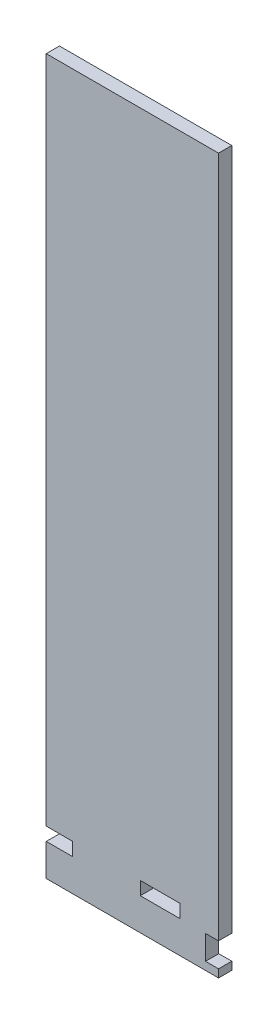
ISO-10303-21;
HEADER;
FILE_DESCRIPTION(('STEP AP214'),'2;1');
FILE_NAME('part.step','',(''),(''),'','','');
FILE_SCHEMA(('AUTOMOTIVE_DESIGN { 1 0 10303 214 1 1 1 1 }'));
ENDSEC;
DATA;
#1=APPLICATION_CONTEXT('core data for automotive mechanical design processes');
#2=APPLICATION_PROTOCOL_DEFINITION('international standard','automotive_design',2000,#1);
#3=PRODUCT_CONTEXT('',#1,'mechanical');
#4=PRODUCT('Part','Part','',(#3));
#5=PRODUCT_RELATED_PRODUCT_CATEGORY('part','',(#4));
#6=PRODUCT_DEFINITION_FORMATION('','',#4);
#7=PRODUCT_DEFINITION_CONTEXT('part definition',#1,'design');
#8=PRODUCT_DEFINITION('design','',#6,#7);
#9=PRODUCT_DEFINITION_SHAPE('','',#8);
#10=(LENGTH_UNIT() NAMED_UNIT(*) SI_UNIT(.MILLI.,.METRE.));
#11=(NAMED_UNIT(*) PLANE_ANGLE_UNIT() SI_UNIT($,.RADIAN.));
#12=(NAMED_UNIT(*) SI_UNIT($,.STERADIAN.) SOLID_ANGLE_UNIT());
#13=UNCERTAINTY_MEASURE_WITH_UNIT(LENGTH_MEASURE(1.E-05),#10,'distance_accuracy_value','');
#14=(GEOMETRIC_REPRESENTATION_CONTEXT(3) GLOBAL_UNCERTAINTY_ASSIGNED_CONTEXT((#13)) GLOBAL_UNIT_ASSIGNED_CONTEXT((#10,
#11,#12)) REPRESENTATION_CONTEXT('',''));
#15=CARTESIAN_POINT('',(0.,0.,0.));
#16=DIRECTION('',(0.,0.,1.));
#17=DIRECTION('',(1.,0.,0.));
#18=AXIS2_PLACEMENT_3D('',#15,#16,#17);
#19=CARTESIAN_POINT('',(65.1210948690311,0.,-5.));
#20=DIRECTION('',(1.,0.,0.));
#21=DIRECTION('',(0.,0.,-1.));
#22=AXIS2_PLACEMENT_3D('',#19,#20,#21);
#23=PLANE('',#22);
#24=DIRECTION('',(0.,0.,1.));
#25=VECTOR('',#24,1.);
#26=CARTESIAN_POINT('',(65.1210948690311,2.9999999999999,-5.));
#27=LINE('',#26,#25);
#28=CARTESIAN_POINT('',(65.1210948690311,2.9999999999999,-5.));
#29=VERTEX_POINT('',#28);
#30=CARTESIAN_POINT('',(65.1210948690311,2.9999999999999,0.));
#31=VERTEX_POINT('',#30);
#32=EDGE_CURVE('E266',#29,#31,#27,.T.);
#33=ORIENTED_EDGE('',*,*,#32,.T.);
#34=DIRECTION('',(0.,1.,0.));
#35=VECTOR('',#34,1.);
#36=CARTESIAN_POINT('',(65.1210948690311,0.,0.));
#37=LINE('',#36,#35);
#38=CARTESIAN_POINT('',(65.1210948690311,0.,0.));
#39=VERTEX_POINT('',#38);
#40=EDGE_CURVE('E188',#39,#31,#37,.T.);
#41=ORIENTED_EDGE('',*,*,#40,.F.);
#42=DIRECTION('',(0.,0.,1.));
#43=VECTOR('',#42,1.);
#44=CARTESIAN_POINT('',(65.1210948690311,0.,-5.));
#45=LINE('',#44,#43);
#46=CARTESIAN_POINT('',(65.1210948690311,0.,-5.));
#47=VERTEX_POINT('',#46);
#48=EDGE_CURVE('E11',#47,#39,#45,.T.);
#49=ORIENTED_EDGE('',*,*,#48,.F.);
#50=DIRECTION('',(0.,1.,0.));
#51=VECTOR('',#50,1.);
#52=CARTESIAN_POINT('',(65.1210948690311,0.,-5.));
#53=LINE('',#52,#51);
#54=EDGE_CURVE('E169',#47,#29,#53,.T.);
#55=ORIENTED_EDGE('',*,*,#54,.T.);
#56=EDGE_LOOP('',(#33,#41,#49,#55));
#57=FACE_BOUND('',#56,.T.);
#58=ADVANCED_FACE('F33',(#57),#23,.T.);
#59=CARTESIAN_POINT('',(0.,0.,-5.));
#60=DIRECTION('',(-1.,0.,0.));
#61=DIRECTION('',(0.,0.,1.));
#62=AXIS2_PLACEMENT_3D('',#59,#60,#61);
#63=PLANE('',#62);
#64=DIRECTION('',(0.,0.,1.));
#65=VECTOR('',#64,1.);
#66=CARTESIAN_POINT('',(0.,17.15,-5.));
#67=LINE('',#66,#65);
#68=CARTESIAN_POINT('',(0.,17.15,-5.));
#69=VERTEX_POINT('',#68);
#70=CARTESIAN_POINT('',(0.,17.15,0.));
#71=VERTEX_POINT('',#70);
#72=EDGE_CURVE('E210',#69,#71,#67,.T.);
#73=ORIENTED_EDGE('',*,*,#72,.T.);
#74=DIRECTION('',(0.,-1.,0.));
#75=VECTOR('',#74,1.);
#76=CARTESIAN_POINT('',(0.,0.,0.));
#77=LINE('',#76,#75);
#78=CARTESIAN_POINT('',(0.,270.,0.));
#79=VERTEX_POINT('',#78);
#80=EDGE_CURVE('E174',#79,#71,#77,.T.);
#81=ORIENTED_EDGE('',*,*,#80,.F.);
#82=DIRECTION('',(0.,0.,1.));
#83=VECTOR('',#82,1.);
#84=CARTESIAN_POINT('',(0.,270.,-5.));
#85=LINE('',#84,#83);
#86=CARTESIAN_POINT('',(0.,270.,-5.));
#87=VERTEX_POINT('',#86);
#88=EDGE_CURVE('E198',#87,#79,#85,.T.);
#89=ORIENTED_EDGE('',*,*,#88,.F.);
#90=DIRECTION('',(0.,-1.,0.));
#91=VECTOR('',#90,1.);
#92=CARTESIAN_POINT('',(0.,0.,-5.));
#93=LINE('',#92,#91);
#94=EDGE_CURVE('E182',#87,#69,#93,.T.);
#95=ORIENTED_EDGE('',*,*,#94,.T.);
#96=EDGE_LOOP('',(#73,#81,#89,#95));
#97=FACE_BOUND('',#96,.T.);
#98=ADVANCED_FACE('F305',(#97),#63,.T.);
#99=DIRECTION('',(0.,0.,1.));
#100=VECTOR('',#99,1.);
#101=CARTESIAN_POINT('',(65.1210948690311,12.15,-5.));
#102=LINE('',#101,#100);
#103=CARTESIAN_POINT('',(65.1210948690311,12.15,-5.));
#104=VERTEX_POINT('',#103);
#105=CARTESIAN_POINT('',(65.1210948690311,12.15,0.));
#106=VERTEX_POINT('',#105);
#107=EDGE_CURVE('E50',#104,#106,#102,.T.);
#108=ORIENTED_EDGE('',*,*,#107,.F.);
#109=CARTESIAN_POINT('',(65.1210948690311,270.,-5.));
#110=VERTEX_POINT('',#109);
#111=EDGE_CURVE('E159',#104,#110,#53,.T.);
#112=ORIENTED_EDGE('',*,*,#111,.T.);
#113=DIRECTION('',(0.,0.,1.));
#114=VECTOR('',#113,1.);
#115=CARTESIAN_POINT('',(65.1210948690311,270.,-5.));
#116=LINE('',#115,#114);
#117=CARTESIAN_POINT('',(65.1210948690311,270.,0.));
#118=VERTEX_POINT('',#117);
#119=EDGE_CURVE('E37',#110,#118,#116,.T.);
#120=ORIENTED_EDGE('',*,*,#119,.T.);
#121=EDGE_CURVE('E161',#106,#118,#37,.T.);
#122=ORIENTED_EDGE('',*,*,#121,.F.);
#123=EDGE_LOOP('',(#108,#112,#120,#122));
#124=FACE_BOUND('',#123,.T.);
#125=ADVANCED_FACE('F35',(#124),#23,.T.);
#126=CARTESIAN_POINT('',(65.1210948690311,0.,-5.));
#127=DIRECTION('',(0.,-1.,0.));
#128=DIRECTION('',(0.,0.,-1.));
#129=AXIS2_PLACEMENT_3D('',#126,#127,#128);
#130=PLANE('',#129);
#131=DIRECTION('',(1.,0.,0.));
#132=VECTOR('',#131,1.);
#133=CARTESIAN_POINT('',(65.1210948690311,0.,0.));
#134=LINE('',#133,#132);
#135=CARTESIAN_POINT('',(0.,0.,0.));
#136=VERTEX_POINT('',#135);
#137=EDGE_CURVE('E170',#136,#39,#134,.T.);
#138=ORIENTED_EDGE('',*,*,#137,.F.);
#139=DIRECTION('',(0.,0.,1.));
#140=VECTOR('',#139,1.);
#141=CARTESIAN_POINT('',(0.,0.,-5.));
#142=LINE('',#141,#140);
#143=CARTESIAN_POINT('',(0.,0.,-5.));
#144=VERTEX_POINT('',#143);
#145=EDGE_CURVE('E42',#144,#136,#142,.T.);
#146=ORIENTED_EDGE('',*,*,#145,.F.);
#147=DIRECTION('',(1.,0.,0.));
#148=VECTOR('',#147,1.);
#149=CARTESIAN_POINT('',(65.1210948690311,0.,-5.));
#150=LINE('',#149,#148);
#151=EDGE_CURVE('E185',#144,#47,#150,.T.);
#152=ORIENTED_EDGE('',*,*,#151,.T.);
#153=ORIENTED_EDGE('',*,*,#48,.T.);
#154=EDGE_LOOP('',(#138,#146,#152,#153));
#155=FACE_BOUND('',#154,.T.);
#156=ADVANCED_FACE('F299',(#155),#130,.T.);
#157=DIRECTION('',(0.,0.,1.));
#158=VECTOR('',#157,1.);
#159=CARTESIAN_POINT('',(0.,12.15,-5.));
#160=LINE('',#159,#158);
#161=CARTESIAN_POINT('',(0.,12.15,-5.));
#162=VERTEX_POINT('',#161);
#163=CARTESIAN_POINT('',(0.,12.15,0.));
#164=VERTEX_POINT('',#163);
#165=EDGE_CURVE('E178',#162,#164,#160,.T.);
#166=ORIENTED_EDGE('',*,*,#165,.F.);
#167=EDGE_CURVE('E181',#162,#144,#93,.T.);
#168=ORIENTED_EDGE('',*,*,#167,.T.);
#169=ORIENTED_EDGE('',*,*,#145,.T.);
#170=EDGE_CURVE('E194',#164,#136,#77,.T.);
#171=ORIENTED_EDGE('',*,*,#170,.F.);
#172=EDGE_LOOP('',(#166,#168,#169,#171));
#173=FACE_BOUND('',#172,.T.);
#174=ADVANCED_FACE('F302',(#173),#63,.T.);
#175=CARTESIAN_POINT('',(65.1210948690311,270.,-5.));
#176=DIRECTION('',(0.,1.,0.));
#177=DIRECTION('',(0.,0.,1.));
#178=AXIS2_PLACEMENT_3D('',#175,#176,#177);
#179=PLANE('',#178);
#180=DIRECTION('',(-1.,0.,0.));
#181=VECTOR('',#180,1.);
#182=CARTESIAN_POINT('',(65.1210948690311,270.,0.));
#183=LINE('',#182,#181);
#184=EDGE_CURVE('E191',#118,#79,#183,.T.);
#185=ORIENTED_EDGE('',*,*,#184,.F.);
#186=ORIENTED_EDGE('',*,*,#119,.F.);
#187=DIRECTION('',(-1.,0.,0.));
#188=VECTOR('',#187,1.);
#189=CARTESIAN_POINT('',(65.1210948690311,270.,-5.));
#190=LINE('',#189,#188);
#191=EDGE_CURVE('E168',#110,#87,#190,.T.);
#192=ORIENTED_EDGE('',*,*,#191,.T.);
#193=ORIENTED_EDGE('',*,*,#88,.T.);
#194=EDGE_LOOP('',(#185,#186,#192,#193));
#195=FACE_BOUND('',#194,.T.);
#196=ADVANCED_FACE('F202',(#195),#179,.T.);
#197=CARTESIAN_POINT('',(0.,0.,-5.));
#198=DIRECTION('',(0.,0.,1.));
#199=DIRECTION('',(1.,0.,0.));
#200=AXIS2_PLACEMENT_3D('',#197,#198,#199);
#201=PLANE('',#200);
#202=DIRECTION('',(1.,0.,0.));
#203=VECTOR('',#202,1.);
#204=CARTESIAN_POINT('',(50.5492928242318,12.15,-5.));
#205=LINE('',#204,#203);
#206=CARTESIAN_POINT('',(35.5492928242318,12.15,-5.));
#207=VERTEX_POINT('',#206);
#208=CARTESIAN_POINT('',(50.5492928242318,12.15,-5.));
#209=VERTEX_POINT('',#208);
#210=EDGE_CURVE('E249',#207,#209,#205,.T.);
#211=ORIENTED_EDGE('',*,*,#210,.T.);
#212=DIRECTION('',(0.,1.,0.));
#213=VECTOR('',#212,1.);
#214=CARTESIAN_POINT('',(50.5492928242318,17.15,-5.));
#215=LINE('',#214,#213);
#216=CARTESIAN_POINT('',(50.5492928242318,17.15,-5.));
#217=VERTEX_POINT('',#216);
#218=EDGE_CURVE('E257',#209,#217,#215,.T.);
#219=ORIENTED_EDGE('',*,*,#218,.T.);
#220=DIRECTION('',(-1.,0.,0.));
#221=VECTOR('',#220,1.);
#222=CARTESIAN_POINT('',(50.5492928242318,17.15,-5.));
#223=LINE('',#222,#221);
#224=CARTESIAN_POINT('',(35.5492928242318,17.15,-5.));
#225=VERTEX_POINT('',#224);
#226=EDGE_CURVE('E270',#217,#225,#223,.T.);
#227=ORIENTED_EDGE('',*,*,#226,.T.);
#228=DIRECTION('',(0.,-1.,0.));
#229=VECTOR('',#228,1.);
#230=CARTESIAN_POINT('',(35.5492928242318,17.15,-5.));
#231=LINE('',#230,#229);
#232=EDGE_CURVE('E58',#225,#207,#231,.T.);
#233=ORIENTED_EDGE('',*,*,#232,.T.);
#234=EDGE_LOOP('',(#211,#219,#227,#233));
#235=FACE_BOUND('',#234,.T.);
#236=DIRECTION('',(0.,-1.,0.));
#237=VECTOR('',#236,1.);
#238=CARTESIAN_POINT('',(60.2010948690311,12.15,-5.));
#239=LINE('',#238,#237);
#240=CARTESIAN_POINT('',(60.2010948690311,12.15,-5.));
#241=VERTEX_POINT('',#240);
#242=CARTESIAN_POINT('',(60.2010948690311,2.9999999999999,-5.));
#243=VERTEX_POINT('',#242);
#244=EDGE_CURVE('E153',#241,#243,#239,.T.);
#245=ORIENTED_EDGE('',*,*,#244,.T.);
#246=DIRECTION('',(1.,0.,0.));
#247=VECTOR('',#246,1.);
#248=CARTESIAN_POINT('',(65.1210948690311,2.9999999999999,-5.));
#249=LINE('',#248,#247);
#250=EDGE_CURVE('E162',#243,#29,#249,.T.);
#251=ORIENTED_EDGE('',*,*,#250,.T.);
#252=ORIENTED_EDGE('',*,*,#54,.F.);
#253=ORIENTED_EDGE('',*,*,#151,.F.);
#254=ORIENTED_EDGE('',*,*,#167,.F.);
#255=DIRECTION('',(1.,0.,0.));
#256=VECTOR('',#255,1.);
#257=CARTESIAN_POINT('',(0.,12.15,-5.));
#258=LINE('',#257,#256);
#259=CARTESIAN_POINT('',(10.0000000000002,12.15,-5.));
#260=VERTEX_POINT('',#259);
#261=EDGE_CURVE('E233',#162,#260,#258,.T.);
#262=ORIENTED_EDGE('',*,*,#261,.T.);
#263=DIRECTION('',(0.,1.,0.));
#264=VECTOR('',#263,1.);
#265=CARTESIAN_POINT('',(10.0000000000002,17.15,-5.));
#266=LINE('',#265,#264);
#267=CARTESIAN_POINT('',(10.0000000000002,17.15,-5.));
#268=VERTEX_POINT('',#267);
#269=EDGE_CURVE('E229',#260,#268,#266,.T.);
#270=ORIENTED_EDGE('',*,*,#269,.T.);
#271=DIRECTION('',(-1.,0.,0.));
#272=VECTOR('',#271,1.);
#273=CARTESIAN_POINT('',(0.,17.15,-5.));
#274=LINE('',#273,#272);
#275=EDGE_CURVE('E224',#268,#69,#274,.T.);
#276=ORIENTED_EDGE('',*,*,#275,.T.);
#277=ORIENTED_EDGE('',*,*,#94,.F.);
#278=ORIENTED_EDGE('',*,*,#191,.F.);
#279=ORIENTED_EDGE('',*,*,#111,.F.);
#280=DIRECTION('',(-1.,0.,0.));
#281=VECTOR('',#280,1.);
#282=CARTESIAN_POINT('',(65.1210948690311,12.15,-5.));
#283=LINE('',#282,#281);
#284=EDGE_CURVE('E146',#104,#241,#283,.T.);
#285=ORIENTED_EDGE('',*,*,#284,.T.);
#286=EDGE_LOOP('',(#245,#251,#252,#253,#254,#262,#270,#276,#277,#278,#279,#285));
#287=FACE_BOUND('',#286,.T.);
#288=ADVANCED_FACE('F165',(#235,#287),#201,.F.);
#289=CARTESIAN_POINT('',(0.,0.,0.));
#290=DIRECTION('',(0.,0.,1.));
#291=DIRECTION('',(1.,0.,0.));
#292=AXIS2_PLACEMENT_3D('',#289,#290,#291);
#293=PLANE('',#292);
#294=DIRECTION('',(1.,0.,0.));
#295=VECTOR('',#294,1.);
#296=CARTESIAN_POINT('',(65.1210948690311,2.9999999999999,0.));
#297=LINE('',#296,#295);
#298=CARTESIAN_POINT('',(60.2010948690311,2.9999999999999,0.));
#299=VERTEX_POINT('',#298);
#300=EDGE_CURVE('E154',#299,#31,#297,.T.);
#301=ORIENTED_EDGE('',*,*,#300,.F.);
#302=DIRECTION('',(0.,-1.,0.));
#303=VECTOR('',#302,1.);
#304=CARTESIAN_POINT('',(60.2010948690311,12.15,0.));
#305=LINE('',#304,#303);
#306=CARTESIAN_POINT('',(60.2010948690311,12.15,0.));
#307=VERTEX_POINT('',#306);
#308=EDGE_CURVE('E281',#307,#299,#305,.T.);
#309=ORIENTED_EDGE('',*,*,#308,.F.);
#310=DIRECTION('',(-1.,0.,0.));
#311=VECTOR('',#310,1.);
#312=CARTESIAN_POINT('',(65.1210948690311,12.15,0.));
#313=LINE('',#312,#311);
#314=EDGE_CURVE('E209',#106,#307,#313,.T.);
#315=ORIENTED_EDGE('',*,*,#314,.F.);
#316=ORIENTED_EDGE('',*,*,#121,.T.);
#317=ORIENTED_EDGE('',*,*,#184,.T.);
#318=ORIENTED_EDGE('',*,*,#80,.T.);
#319=DIRECTION('',(-1.,0.,0.));
#320=VECTOR('',#319,1.);
#321=CARTESIAN_POINT('',(0.,17.15,0.));
#322=LINE('',#321,#320);
#323=CARTESIAN_POINT('',(10.0000000000002,17.15,0.));
#324=VERTEX_POINT('',#323);
#325=EDGE_CURVE('E218',#324,#71,#322,.T.);
#326=ORIENTED_EDGE('',*,*,#325,.F.);
#327=DIRECTION('',(0.,1.,0.));
#328=VECTOR('',#327,1.);
#329=CARTESIAN_POINT('',(10.0000000000002,17.15,0.));
#330=LINE('',#329,#328);
#331=CARTESIAN_POINT('',(10.0000000000002,12.15,0.));
#332=VERTEX_POINT('',#331);
#333=EDGE_CURVE('E238',#332,#324,#330,.T.);
#334=ORIENTED_EDGE('',*,*,#333,.F.);
#335=DIRECTION('',(1.,0.,0.));
#336=VECTOR('',#335,1.);
#337=CARTESIAN_POINT('',(0.,12.15,0.));
#338=LINE('',#337,#336);
#339=EDGE_CURVE('E237',#164,#332,#338,.T.);
#340=ORIENTED_EDGE('',*,*,#339,.F.);
#341=ORIENTED_EDGE('',*,*,#170,.T.);
#342=ORIENTED_EDGE('',*,*,#137,.T.);
#343=ORIENTED_EDGE('',*,*,#40,.T.);
#344=EDGE_LOOP('',(#301,#309,#315,#316,#317,#318,#326,#334,#340,#341,#342,#343));
#345=FACE_BOUND('',#344,.T.);
#346=DIRECTION('',(0.,1.,0.));
#347=VECTOR('',#346,1.);
#348=CARTESIAN_POINT('',(50.5492928242318,17.15,0.));
#349=LINE('',#348,#347);
#350=CARTESIAN_POINT('',(50.5492928242318,12.15,0.));
#351=VERTEX_POINT('',#350);
#352=CARTESIAN_POINT('',(50.5492928242318,17.15,0.));
#353=VERTEX_POINT('',#352);
#354=EDGE_CURVE('E264',#351,#353,#349,.T.);
#355=ORIENTED_EDGE('',*,*,#354,.F.);
#356=DIRECTION('',(1.,0.,0.));
#357=VECTOR('',#356,1.);
#358=CARTESIAN_POINT('',(50.5492928242318,12.15,0.));
#359=LINE('',#358,#357);
#360=CARTESIAN_POINT('',(35.5492928242318,12.15,0.));
#361=VERTEX_POINT('',#360);
#362=EDGE_CURVE('E254',#361,#351,#359,.T.);
#363=ORIENTED_EDGE('',*,*,#362,.F.);
#364=DIRECTION('',(0.,-1.,0.));
#365=VECTOR('',#364,1.);
#366=CARTESIAN_POINT('',(35.5492928242318,17.15,0.));
#367=LINE('',#366,#365);
#368=CARTESIAN_POINT('',(35.5492928242318,17.15,0.));
#369=VERTEX_POINT('',#368);
#370=EDGE_CURVE('E258',#369,#361,#367,.T.);
#371=ORIENTED_EDGE('',*,*,#370,.F.);
#372=DIRECTION('',(-1.,0.,0.));
#373=VECTOR('',#372,1.);
#374=CARTESIAN_POINT('',(50.5492928242318,17.15,0.));
#375=LINE('',#374,#373);
#376=EDGE_CURVE('E261',#353,#369,#375,.T.);
#377=ORIENTED_EDGE('',*,*,#376,.F.);
#378=EDGE_LOOP('',(#355,#363,#371,#377));
#379=FACE_BOUND('',#378,.T.);
#380=ADVANCED_FACE('F205',(#345,#379),#293,.T.);
#381=CARTESIAN_POINT('',(0.,17.15,-5.));
#382=DIRECTION('',(0.,1.,0.));
#383=DIRECTION('',(0.,0.,1.));
#384=AXIS2_PLACEMENT_3D('',#381,#382,#383);
#385=PLANE('',#384);
#386=ORIENTED_EDGE('',*,*,#325,.T.);
#387=ORIENTED_EDGE('',*,*,#72,.F.);
#388=ORIENTED_EDGE('',*,*,#275,.F.);
#389=DIRECTION('',(0.,0.,1.));
#390=VECTOR('',#389,1.);
#391=CARTESIAN_POINT('',(10.0000000000002,17.15,-5.));
#392=LINE('',#391,#390);
#393=EDGE_CURVE('E212',#268,#324,#392,.T.);
#394=ORIENTED_EDGE('',*,*,#393,.T.);
#395=EDGE_LOOP('',(#386,#387,#388,#394));
#396=FACE_BOUND('',#395,.T.);
#397=ADVANCED_FACE('F339',(#396),#385,.F.);
#398=CARTESIAN_POINT('',(10.0000000000002,17.15,-5.));
#399=DIRECTION('',(1.,0.,0.));
#400=DIRECTION('',(0.,0.,-1.));
#401=AXIS2_PLACEMENT_3D('',#398,#399,#400);
#402=PLANE('',#401);
#403=ORIENTED_EDGE('',*,*,#333,.T.);
#404=ORIENTED_EDGE('',*,*,#393,.F.);
#405=ORIENTED_EDGE('',*,*,#269,.F.);
#406=DIRECTION('',(0.,0.,1.));
#407=VECTOR('',#406,1.);
#408=CARTESIAN_POINT('',(10.0000000000002,12.15,-5.));
#409=LINE('',#408,#407);
#410=EDGE_CURVE('E215',#260,#332,#409,.T.);
#411=ORIENTED_EDGE('',*,*,#410,.T.);
#412=EDGE_LOOP('',(#403,#404,#405,#411));
#413=FACE_BOUND('',#412,.T.);
#414=ADVANCED_FACE('F344',(#413),#402,.F.);
#415=CARTESIAN_POINT('',(0.,12.15,-5.));
#416=DIRECTION('',(0.,-1.,0.));
#417=DIRECTION('',(0.,0.,-1.));
#418=AXIS2_PLACEMENT_3D('',#415,#416,#417);
#419=PLANE('',#418);
#420=ORIENTED_EDGE('',*,*,#339,.T.);
#421=ORIENTED_EDGE('',*,*,#410,.F.);
#422=ORIENTED_EDGE('',*,*,#261,.F.);
#423=ORIENTED_EDGE('',*,*,#165,.T.);
#424=EDGE_LOOP('',(#420,#421,#422,#423));
#425=FACE_BOUND('',#424,.T.);
#426=ADVANCED_FACE('F353',(#425),#419,.F.);
#427=CARTESIAN_POINT('',(50.5492928242318,17.15,-5.));
#428=DIRECTION('',(1.,0.,0.));
#429=DIRECTION('',(0.,0.,-1.));
#430=AXIS2_PLACEMENT_3D('',#427,#428,#429);
#431=PLANE('',#430);
#432=ORIENTED_EDGE('',*,*,#354,.T.);
#433=DIRECTION('',(0.,0.,1.));
#434=VECTOR('',#433,1.);
#435=CARTESIAN_POINT('',(50.5492928242318,17.15,-5.));
#436=LINE('',#435,#434);
#437=EDGE_CURVE('E245',#217,#353,#436,.T.);
#438=ORIENTED_EDGE('',*,*,#437,.F.);
#439=ORIENTED_EDGE('',*,*,#218,.F.);
#440=DIRECTION('',(0.,0.,1.));
#441=VECTOR('',#440,1.);
#442=CARTESIAN_POINT('',(50.5492928242318,12.15,-5.));
#443=LINE('',#442,#441);
#444=EDGE_CURVE('E239',#209,#351,#443,.T.);
#445=ORIENTED_EDGE('',*,*,#444,.T.);
#446=EDGE_LOOP('',(#432,#438,#439,#445));
#447=FACE_BOUND('',#446,.T.);
#448=ADVANCED_FACE('F361',(#447),#431,.F.);
#449=CARTESIAN_POINT('',(50.5492928242318,12.15,-5.));
#450=DIRECTION('',(0.,-1.,0.));
#451=DIRECTION('',(0.,0.,-1.));
#452=AXIS2_PLACEMENT_3D('',#449,#450,#451);
#453=PLANE('',#452);
#454=ORIENTED_EDGE('',*,*,#362,.T.);
#455=ORIENTED_EDGE('',*,*,#444,.F.);
#456=ORIENTED_EDGE('',*,*,#210,.F.);
#457=DIRECTION('',(0.,0.,1.));
#458=VECTOR('',#457,1.);
#459=CARTESIAN_POINT('',(35.5492928242318,12.15,-5.));
#460=LINE('',#459,#458);
#461=EDGE_CURVE('E251',#207,#361,#460,.T.);
#462=ORIENTED_EDGE('',*,*,#461,.T.);
#463=EDGE_LOOP('',(#454,#455,#456,#462));
#464=FACE_BOUND('',#463,.T.);
#465=ADVANCED_FACE('F369',(#464),#453,.F.);
#466=CARTESIAN_POINT('',(35.5492928242318,17.15,-5.));
#467=DIRECTION('',(-1.,0.,0.));
#468=DIRECTION('',(0.,0.,1.));
#469=AXIS2_PLACEMENT_3D('',#466,#467,#468);
#470=PLANE('',#469);
#471=ORIENTED_EDGE('',*,*,#370,.T.);
#472=ORIENTED_EDGE('',*,*,#461,.F.);
#473=ORIENTED_EDGE('',*,*,#232,.F.);
#474=DIRECTION('',(0.,0.,1.));
#475=VECTOR('',#474,1.);
#476=CARTESIAN_POINT('',(35.5492928242318,17.15,-5.));
#477=LINE('',#476,#475);
#478=EDGE_CURVE('E248',#225,#369,#477,.T.);
#479=ORIENTED_EDGE('',*,*,#478,.T.);
#480=EDGE_LOOP('',(#471,#472,#473,#479));
#481=FACE_BOUND('',#480,.T.);
#482=ADVANCED_FACE('F378',(#481),#470,.F.);
#483=CARTESIAN_POINT('',(50.5492928242318,17.15,-5.));
#484=DIRECTION('',(0.,1.,0.));
#485=DIRECTION('',(0.,0.,1.));
#486=AXIS2_PLACEMENT_3D('',#483,#484,#485);
#487=PLANE('',#486);
#488=ORIENTED_EDGE('',*,*,#376,.T.);
#489=ORIENTED_EDGE('',*,*,#478,.F.);
#490=ORIENTED_EDGE('',*,*,#226,.F.);
#491=ORIENTED_EDGE('',*,*,#437,.T.);
#492=EDGE_LOOP('',(#488,#489,#490,#491));
#493=FACE_BOUND('',#492,.T.);
#494=ADVANCED_FACE('F387',(#493),#487,.F.);
#495=CARTESIAN_POINT('',(65.1210948690311,2.9999999999999,-5.));
#496=DIRECTION('',(0.,-1.,0.));
#497=DIRECTION('',(0.,0.,-1.));
#498=AXIS2_PLACEMENT_3D('',#495,#496,#497);
#499=PLANE('',#498);
#500=ORIENTED_EDGE('',*,*,#300,.T.);
#501=ORIENTED_EDGE('',*,*,#32,.F.);
#502=ORIENTED_EDGE('',*,*,#250,.F.);
#503=DIRECTION('',(0.,0.,1.));
#504=VECTOR('',#503,1.);
#505=CARTESIAN_POINT('',(60.2010948690311,2.9999999999999,-5.));
#506=LINE('',#505,#504);
#507=EDGE_CURVE('E276',#243,#299,#506,.T.);
#508=ORIENTED_EDGE('',*,*,#507,.T.);
#509=EDGE_LOOP('',(#500,#501,#502,#508));
#510=FACE_BOUND('',#509,.T.);
#511=ADVANCED_FACE('F292',(#510),#499,.F.);
#512=CARTESIAN_POINT('',(60.2010948690311,12.15,-5.));
#513=DIRECTION('',(-1.,0.,0.));
#514=DIRECTION('',(0.,0.,1.));
#515=AXIS2_PLACEMENT_3D('',#512,#513,#514);
#516=PLANE('',#515);
#517=ORIENTED_EDGE('',*,*,#308,.T.);
#518=ORIENTED_EDGE('',*,*,#507,.F.);
#519=ORIENTED_EDGE('',*,*,#244,.F.);
#520=DIRECTION('',(0.,0.,1.));
#521=VECTOR('',#520,1.);
#522=CARTESIAN_POINT('',(60.2010948690311,12.15,-5.));
#523=LINE('',#522,#521);
#524=EDGE_CURVE('E148',#241,#307,#523,.T.);
#525=ORIENTED_EDGE('',*,*,#524,.T.);
#526=EDGE_LOOP('',(#517,#518,#519,#525));
#527=FACE_BOUND('',#526,.T.);
#528=ADVANCED_FACE('F290',(#527),#516,.F.);
#529=CARTESIAN_POINT('',(65.1210948690311,12.15,-5.));
#530=DIRECTION('',(0.,1.,0.));
#531=DIRECTION('',(-1.,0.,0.));
#532=AXIS2_PLACEMENT_3D('',#529,#530,#531);
#533=PLANE('',#532);
#534=ORIENTED_EDGE('',*,*,#314,.T.);
#535=ORIENTED_EDGE('',*,*,#524,.F.);
#536=ORIENTED_EDGE('',*,*,#284,.F.);
#537=ORIENTED_EDGE('',*,*,#107,.T.);
#538=EDGE_LOOP('',(#534,#535,#536,#537));
#539=FACE_BOUND('',#538,.T.);
#540=ADVANCED_FACE('F147',(#539),#533,.F.);
#541=CLOSED_SHELL('',(#58,#98,#125,#156,#174,#196,#288,#380,#397,#414,#426,#448,#465,#482,#494,
#511,#528,#540));
#542=MANIFOLD_SOLID_BREP('B2',#541);
#543=ADVANCED_BREP_SHAPE_REPRESENTATION('',(#18,#542),#14);
#544=SHAPE_DEFINITION_REPRESENTATION(#9,#543);
ENDSEC;
END-ISO-10303-21;
